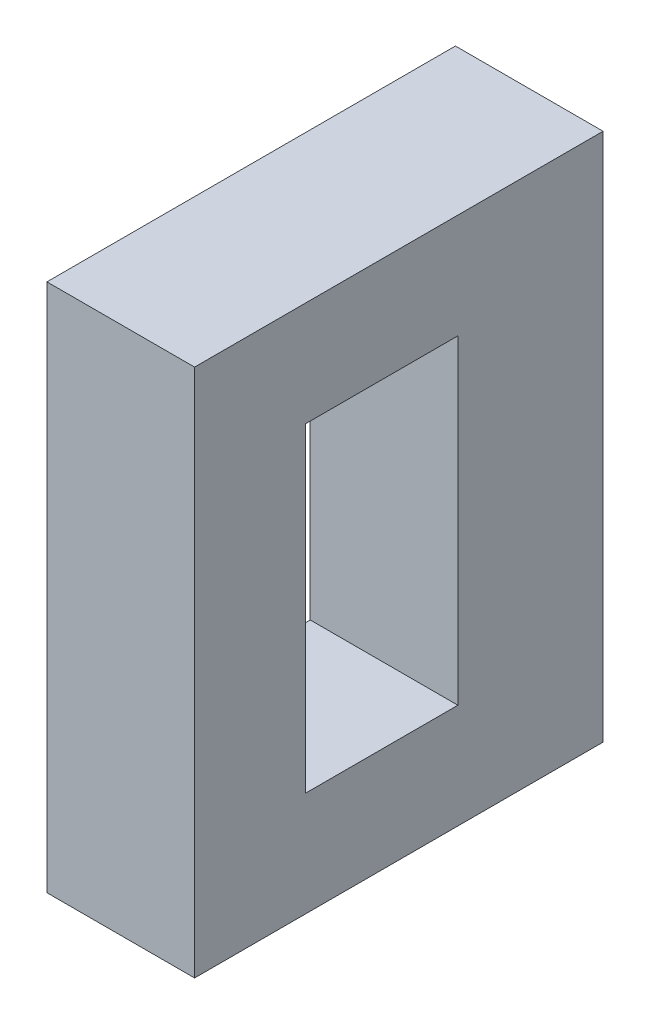
ISO-10303-21;
HEADER;
FILE_DESCRIPTION(('STEP AP214'),'2;1');
FILE_NAME('part.step','',(''),(''),'','','');
FILE_SCHEMA(('AUTOMOTIVE_DESIGN { 1 0 10303 214 1 1 1 1 }'));
ENDSEC;
DATA;
#1=APPLICATION_CONTEXT('core data for automotive mechanical design processes');
#2=APPLICATION_PROTOCOL_DEFINITION('international standard','automotive_design',2000,#1);
#3=PRODUCT_CONTEXT('',#1,'mechanical');
#4=PRODUCT('Part','Part','',(#3));
#5=PRODUCT_RELATED_PRODUCT_CATEGORY('part','',(#4));
#6=PRODUCT_DEFINITION_FORMATION('','',#4);
#7=PRODUCT_DEFINITION_CONTEXT('part definition',#1,'design');
#8=PRODUCT_DEFINITION('design','',#6,#7);
#9=PRODUCT_DEFINITION_SHAPE('','',#8);
#10=(LENGTH_UNIT() NAMED_UNIT(*) SI_UNIT(.MILLI.,.METRE.));
#11=(NAMED_UNIT(*) PLANE_ANGLE_UNIT() SI_UNIT($,.RADIAN.));
#12=(NAMED_UNIT(*) SI_UNIT($,.STERADIAN.) SOLID_ANGLE_UNIT());
#13=UNCERTAINTY_MEASURE_WITH_UNIT(LENGTH_MEASURE(1.E-05),#10,'distance_accuracy_value','');
#14=(GEOMETRIC_REPRESENTATION_CONTEXT(3) GLOBAL_UNCERTAINTY_ASSIGNED_CONTEXT((#13)) GLOBAL_UNIT_ASSIGNED_CONTEXT((#10,
#11,#12)) REPRESENTATION_CONTEXT('',''));
#15=CARTESIAN_POINT('',(0.,0.,0.));
#16=DIRECTION('',(0.,0.,1.));
#17=DIRECTION('',(1.,0.,0.));
#18=AXIS2_PLACEMENT_3D('',#15,#16,#17);
#19=CARTESIAN_POINT('',(56.5,-38.7,20.35));
#20=DIRECTION('',(-1.,0.,0.));
#21=DIRECTION('',(0.,-1.,0.));
#22=AXIS2_PLACEMENT_3D('',#19,#20,#21);
#23=PLANE('',#22);
#24=DIRECTION('',(0.,0.,1.));
#25=VECTOR('',#24,1.);
#26=CARTESIAN_POINT('',(56.5,-32.2,24.15));
#27=LINE('',#26,#25);
#28=CARTESIAN_POINT('',(56.5,-32.2,24.15));
#29=VERTEX_POINT('',#28);
#30=CARTESIAN_POINT('',(56.5,-32.2,17.95));
#31=VERTEX_POINT('',#30);
#32=EDGE_CURVE('E116',#29,#31,#27,.F.);
#33=ORIENTED_EDGE('',*,*,#32,.T.);
#34=DIRECTION('',(0.,1.,0.));
#35=VECTOR('',#34,1.);
#36=CARTESIAN_POINT('',(56.5,-32.2,17.95));
#37=LINE('',#36,#35);
#38=CARTESIAN_POINT('',(56.5,-45.2,17.95));
#39=VERTEX_POINT('',#38);
#40=EDGE_CURVE('E112',#31,#39,#37,.F.);
#41=ORIENTED_EDGE('',*,*,#40,.T.);
#42=DIRECTION('',(0.,0.,1.));
#43=VECTOR('',#42,1.);
#44=CARTESIAN_POINT('',(56.5,-45.2,17.95));
#45=LINE('',#44,#43);
#46=CARTESIAN_POINT('',(56.5,-45.2,24.15));
#47=VERTEX_POINT('',#46);
#48=EDGE_CURVE('E110',#39,#47,#45,.T.);
#49=ORIENTED_EDGE('',*,*,#48,.T.);
#50=DIRECTION('',(0.,-1.,0.));
#51=VECTOR('',#50,1.);
#52=CARTESIAN_POINT('',(56.5,-45.2,24.15));
#53=LINE('',#52,#51);
#54=EDGE_CURVE('E123',#47,#29,#53,.F.);
#55=ORIENTED_EDGE('',*,*,#54,.T.);
#56=EDGE_LOOP('',(#33,#41,#49,#55));
#57=FACE_BOUND('',#56,.T.);
#58=DIRECTION('',(0.,1.,0.));
#59=VECTOR('',#58,1.);
#60=CARTESIAN_POINT('',(56.5,-27.95,12.05));
#61=LINE('',#60,#59);
#62=CARTESIAN_POINT('',(56.5,-27.95,12.05));
#63=VERTEX_POINT('',#62);
#64=CARTESIAN_POINT('',(56.5,-49.45,12.05));
#65=VERTEX_POINT('',#64);
#66=EDGE_CURVE('E93',#63,#65,#61,.F.);
#67=ORIENTED_EDGE('',*,*,#66,.F.);
#68=DIRECTION('',(0.,0.,1.));
#69=VECTOR('',#68,1.);
#70=CARTESIAN_POINT('',(56.5,-27.95,28.65));
#71=LINE('',#70,#69);
#72=CARTESIAN_POINT('',(56.5,-27.95,28.65));
#73=VERTEX_POINT('',#72);
#74=EDGE_CURVE('E80',#73,#63,#71,.F.);
#75=ORIENTED_EDGE('',*,*,#74,.F.);
#76=DIRECTION('',(0.,-1.,0.));
#77=VECTOR('',#76,1.);
#78=CARTESIAN_POINT('',(56.5,-49.45,28.65));
#79=LINE('',#78,#77);
#80=CARTESIAN_POINT('',(56.5,-49.45,28.65));
#81=VERTEX_POINT('',#80);
#82=EDGE_CURVE('E20',#81,#73,#79,.F.);
#83=ORIENTED_EDGE('',*,*,#82,.F.);
#84=DIRECTION('',(0.,0.,1.));
#85=VECTOR('',#84,1.);
#86=CARTESIAN_POINT('',(56.5,-49.45,12.05));
#87=LINE('',#86,#85);
#88=EDGE_CURVE('E107',#65,#81,#87,.T.);
#89=ORIENTED_EDGE('',*,*,#88,.F.);
#90=EDGE_LOOP('',(#67,#75,#83,#89));
#91=FACE_BOUND('',#90,.T.);
#92=ADVANCED_FACE('F17',(#57,#91),#23,.F.);
#93=CARTESIAN_POINT('',(50.5,-49.45,28.65));
#94=DIRECTION('',(0.,0.,1.));
#95=DIRECTION('',(0.,-1.,0.));
#96=AXIS2_PLACEMENT_3D('',#93,#94,#95);
#97=PLANE('',#96);
#98=DIRECTION('',(-1.,0.,0.));
#99=VECTOR('',#98,1.);
#100=CARTESIAN_POINT('',(50.5,-27.95,28.65));
#101=LINE('',#100,#99);
#102=CARTESIAN_POINT('',(50.5,-27.95,28.65));
#103=VERTEX_POINT('',#102);
#104=EDGE_CURVE('E86',#103,#73,#101,.F.);
#105=ORIENTED_EDGE('',*,*,#104,.F.);
#106=DIRECTION('',(0.,-1.,0.));
#107=VECTOR('',#106,1.);
#108=CARTESIAN_POINT('',(50.5,-38.7,28.65));
#109=LINE('',#108,#107);
#110=CARTESIAN_POINT('',(50.5,-49.45,28.65));
#111=VERTEX_POINT('',#110);
#112=EDGE_CURVE('E126',#111,#103,#109,.F.);
#113=ORIENTED_EDGE('',*,*,#112,.F.);
#114=DIRECTION('',(1.,0.,0.));
#115=VECTOR('',#114,1.);
#116=CARTESIAN_POINT('',(50.5,-49.45,28.65));
#117=LINE('',#116,#115);
#118=EDGE_CURVE('E89',#81,#111,#117,.F.);
#119=ORIENTED_EDGE('',*,*,#118,.F.);
#120=ORIENTED_EDGE('',*,*,#82,.T.);
#121=EDGE_LOOP('',(#105,#113,#119,#120));
#122=FACE_BOUND('',#121,.T.);
#123=ADVANCED_FACE('F85',(#122),#97,.T.);
#124=CARTESIAN_POINT('',(50.5,-27.95,28.65));
#125=DIRECTION('',(0.,1.,0.));
#126=DIRECTION('',(-1.,0.,0.));
#127=AXIS2_PLACEMENT_3D('',#124,#125,#126);
#128=PLANE('',#127);
#129=DIRECTION('',(1.,0.,0.));
#130=VECTOR('',#129,1.);
#131=CARTESIAN_POINT('',(50.5,-27.95,12.05));
#132=LINE('',#131,#130);
#133=CARTESIAN_POINT('',(50.5,-27.95,12.05));
#134=VERTEX_POINT('',#133);
#135=EDGE_CURVE('E95',#134,#63,#132,.T.);
#136=ORIENTED_EDGE('',*,*,#135,.F.);
#137=DIRECTION('',(0.,0.,1.));
#138=VECTOR('',#137,1.);
#139=CARTESIAN_POINT('',(50.5,-27.95,20.35));
#140=LINE('',#139,#138);
#141=EDGE_CURVE('E99',#103,#134,#140,.F.);
#142=ORIENTED_EDGE('',*,*,#141,.F.);
#143=ORIENTED_EDGE('',*,*,#104,.T.);
#144=ORIENTED_EDGE('',*,*,#74,.T.);
#145=EDGE_LOOP('',(#136,#142,#143,#144));
#146=FACE_BOUND('',#145,.T.);
#147=ADVANCED_FACE('F97',(#146),#128,.T.);
#148=CARTESIAN_POINT('',(50.5,-27.95,12.05));
#149=DIRECTION('',(0.,0.,-1.));
#150=DIRECTION('',(0.,1.,0.));
#151=AXIS2_PLACEMENT_3D('',#148,#149,#150);
#152=PLANE('',#151);
#153=DIRECTION('',(1.,0.,0.));
#154=VECTOR('',#153,1.);
#155=CARTESIAN_POINT('',(50.5,-49.45,12.05));
#156=LINE('',#155,#154);
#157=CARTESIAN_POINT('',(50.5,-49.45,12.05));
#158=VERTEX_POINT('',#157);
#159=EDGE_CURVE('E104',#158,#65,#156,.T.);
#160=ORIENTED_EDGE('',*,*,#159,.F.);
#161=DIRECTION('',(0.,-1.,0.));
#162=VECTOR('',#161,1.);
#163=CARTESIAN_POINT('',(50.5,-38.7,12.05));
#164=LINE('',#163,#162);
#165=EDGE_CURVE('E129',#134,#158,#164,.T.);
#166=ORIENTED_EDGE('',*,*,#165,.F.);
#167=ORIENTED_EDGE('',*,*,#135,.T.);
#168=ORIENTED_EDGE('',*,*,#66,.T.);
#169=EDGE_LOOP('',(#160,#166,#167,#168));
#170=FACE_BOUND('',#169,.T.);
#171=ADVANCED_FACE('F177',(#170),#152,.T.);
#172=CARTESIAN_POINT('',(50.5,-49.45,12.05));
#173=DIRECTION('',(0.,-1.,0.));
#174=DIRECTION('',(1.,0.,0.));
#175=AXIS2_PLACEMENT_3D('',#172,#173,#174);
#176=PLANE('',#175);
#177=ORIENTED_EDGE('',*,*,#118,.T.);
#178=DIRECTION('',(0.,0.,1.));
#179=VECTOR('',#178,1.);
#180=CARTESIAN_POINT('',(50.5,-49.45,20.35));
#181=LINE('',#180,#179);
#182=EDGE_CURVE('E132',#158,#111,#181,.T.);
#183=ORIENTED_EDGE('',*,*,#182,.F.);
#184=ORIENTED_EDGE('',*,*,#159,.T.);
#185=ORIENTED_EDGE('',*,*,#88,.T.);
#186=EDGE_LOOP('',(#177,#183,#184,#185));
#187=FACE_BOUND('',#186,.T.);
#188=ADVANCED_FACE('F174',(#187),#176,.T.);
#189=CARTESIAN_POINT('',(50.5,-45.2,17.95));
#190=DIRECTION('',(0.,-1.,0.));
#191=DIRECTION('',(1.,0.,0.));
#192=AXIS2_PLACEMENT_3D('',#189,#190,#191);
#193=PLANE('',#192);
#194=DIRECTION('',(1.,0.,0.));
#195=VECTOR('',#194,1.);
#196=CARTESIAN_POINT('',(50.5,-45.2,24.15));
#197=LINE('',#196,#195);
#198=CARTESIAN_POINT('',(50.5,-45.2,24.15));
#199=VERTEX_POINT('',#198);
#200=EDGE_CURVE('E120',#199,#47,#197,.T.);
#201=ORIENTED_EDGE('',*,*,#200,.T.);
#202=ORIENTED_EDGE('',*,*,#48,.F.);
#203=DIRECTION('',(1.,0.,0.));
#204=VECTOR('',#203,1.);
#205=CARTESIAN_POINT('',(50.5,-45.2,17.95));
#206=LINE('',#205,#204);
#207=CARTESIAN_POINT('',(50.5,-45.2,17.95));
#208=VERTEX_POINT('',#207);
#209=EDGE_CURVE('E114',#39,#208,#206,.F.);
#210=ORIENTED_EDGE('',*,*,#209,.T.);
#211=DIRECTION('',(0.,0.,1.));
#212=VECTOR('',#211,1.);
#213=CARTESIAN_POINT('',(50.5,-45.2,20.35));
#214=LINE('',#213,#212);
#215=EDGE_CURVE('E135',#199,#208,#214,.F.);
#216=ORIENTED_EDGE('',*,*,#215,.F.);
#217=EDGE_LOOP('',(#201,#202,#210,#216));
#218=FACE_BOUND('',#217,.T.);
#219=ADVANCED_FACE('F155',(#218),#193,.F.);
#220=CARTESIAN_POINT('',(50.5,-32.2,17.95));
#221=DIRECTION('',(0.,0.,-1.));
#222=DIRECTION('',(0.,1.,0.));
#223=AXIS2_PLACEMENT_3D('',#220,#221,#222);
#224=PLANE('',#223);
#225=ORIENTED_EDGE('',*,*,#209,.F.);
#226=ORIENTED_EDGE('',*,*,#40,.F.);
#227=DIRECTION('',(-1.,0.,0.));
#228=VECTOR('',#227,1.);
#229=CARTESIAN_POINT('',(50.5,-32.2,17.95));
#230=LINE('',#229,#228);
#231=CARTESIAN_POINT('',(50.5,-32.2,17.95));
#232=VERTEX_POINT('',#231);
#233=EDGE_CURVE('E118',#31,#232,#230,.T.);
#234=ORIENTED_EDGE('',*,*,#233,.T.);
#235=DIRECTION('',(0.,-1.,0.));
#236=VECTOR('',#235,1.);
#237=CARTESIAN_POINT('',(50.5,-38.7,17.95));
#238=LINE('',#237,#236);
#239=EDGE_CURVE('E138',#208,#232,#238,.F.);
#240=ORIENTED_EDGE('',*,*,#239,.F.);
#241=EDGE_LOOP('',(#225,#226,#234,#240));
#242=FACE_BOUND('',#241,.T.);
#243=ADVANCED_FACE('F151',(#242),#224,.F.);
#244=CARTESIAN_POINT('',(50.5,-32.2,24.15));
#245=DIRECTION('',(0.,1.,0.));
#246=DIRECTION('',(-1.,0.,0.));
#247=AXIS2_PLACEMENT_3D('',#244,#245,#246);
#248=PLANE('',#247);
#249=ORIENTED_EDGE('',*,*,#233,.F.);
#250=ORIENTED_EDGE('',*,*,#32,.F.);
#251=DIRECTION('',(1.,0.,0.));
#252=VECTOR('',#251,1.);
#253=CARTESIAN_POINT('',(50.5,-32.2,24.15));
#254=LINE('',#253,#252);
#255=CARTESIAN_POINT('',(50.5,-32.2,24.15));
#256=VERTEX_POINT('',#255);
#257=EDGE_CURVE('E35',#29,#256,#254,.F.);
#258=ORIENTED_EDGE('',*,*,#257,.T.);
#259=DIRECTION('',(0.,0.,1.));
#260=VECTOR('',#259,1.);
#261=CARTESIAN_POINT('',(50.5,-32.2,20.35));
#262=LINE('',#261,#260);
#263=EDGE_CURVE('E26',#232,#256,#262,.T.);
#264=ORIENTED_EDGE('',*,*,#263,.F.);
#265=EDGE_LOOP('',(#249,#250,#258,#264));
#266=FACE_BOUND('',#265,.T.);
#267=ADVANCED_FACE('F147',(#266),#248,.F.);
#268=CARTESIAN_POINT('',(50.5,-45.2,24.15));
#269=DIRECTION('',(0.,0.,1.));
#270=DIRECTION('',(0.,-1.,0.));
#271=AXIS2_PLACEMENT_3D('',#268,#269,#270);
#272=PLANE('',#271);
#273=ORIENTED_EDGE('',*,*,#257,.F.);
#274=ORIENTED_EDGE('',*,*,#54,.F.);
#275=ORIENTED_EDGE('',*,*,#200,.F.);
#276=DIRECTION('',(0.,-1.,0.));
#277=VECTOR('',#276,1.);
#278=CARTESIAN_POINT('',(50.5,-38.7,24.15));
#279=LINE('',#278,#277);
#280=EDGE_CURVE('E11',#256,#199,#279,.T.);
#281=ORIENTED_EDGE('',*,*,#280,.F.);
#282=EDGE_LOOP('',(#273,#274,#275,#281));
#283=FACE_BOUND('',#282,.T.);
#284=ADVANCED_FACE('F159',(#283),#272,.F.);
#285=CARTESIAN_POINT('',(50.5,-38.7,20.35));
#286=DIRECTION('',(-1.,0.,0.));
#287=DIRECTION('',(0.,-1.,0.));
#288=AXIS2_PLACEMENT_3D('',#285,#286,#287);
#289=PLANE('',#288);
#290=ORIENTED_EDGE('',*,*,#263,.T.);
#291=ORIENTED_EDGE('',*,*,#280,.T.);
#292=ORIENTED_EDGE('',*,*,#215,.T.);
#293=ORIENTED_EDGE('',*,*,#239,.T.);
#294=EDGE_LOOP('',(#290,#291,#292,#293));
#295=FACE_BOUND('',#294,.T.);
#296=ORIENTED_EDGE('',*,*,#165,.T.);
#297=ORIENTED_EDGE('',*,*,#182,.T.);
#298=ORIENTED_EDGE('',*,*,#112,.T.);
#299=ORIENTED_EDGE('',*,*,#141,.T.);
#300=EDGE_LOOP('',(#296,#297,#298,#299));
#301=FACE_BOUND('',#300,.T.);
#302=ADVANCED_FACE('F143',(#295,#301),#289,.T.);
#303=CLOSED_SHELL('',(#92,#123,#147,#171,#188,#219,#243,#267,#284,#302));
#304=MANIFOLD_SOLID_BREP('B1',#303);
#305=ADVANCED_BREP_SHAPE_REPRESENTATION('',(#18,#304),#14);
#306=SHAPE_DEFINITION_REPRESENTATION(#9,#305);
ENDSEC;
END-ISO-10303-21;
